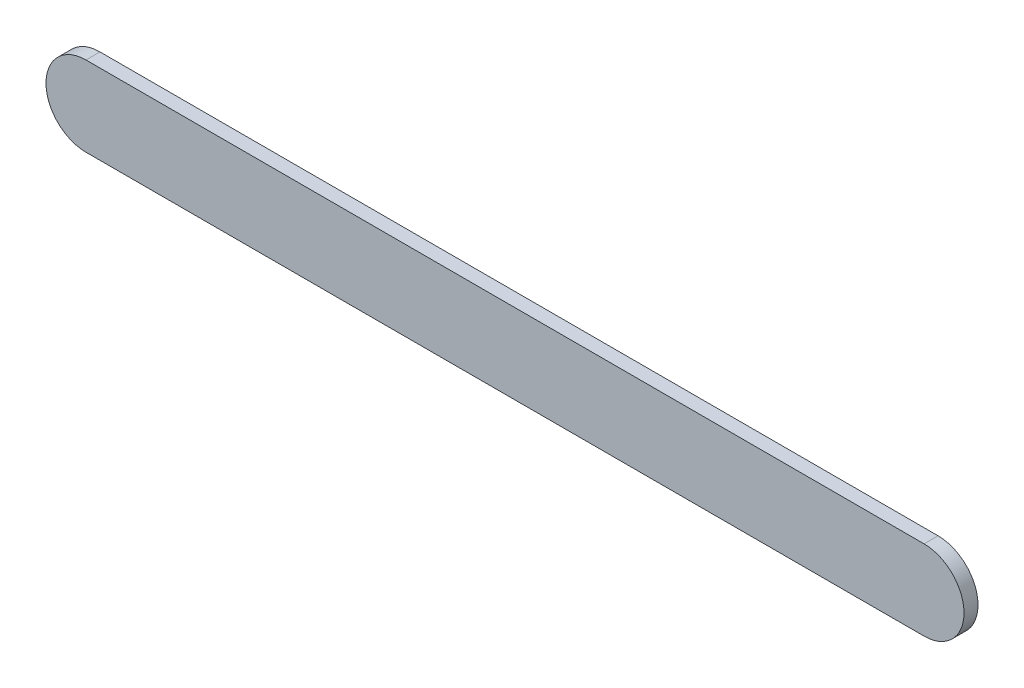
ISO-10303-21;
HEADER;
FILE_DESCRIPTION(('STEP AP214'),'2;1');
FILE_NAME('part.step','',(''),(''),'','','');
FILE_SCHEMA(('AUTOMOTIVE_DESIGN { 1 0 10303 214 1 1 1 1 }'));
ENDSEC;
DATA;
#1=APPLICATION_CONTEXT('core data for automotive mechanical design processes');
#2=APPLICATION_PROTOCOL_DEFINITION('international standard','automotive_design',2000,#1);
#3=PRODUCT_CONTEXT('',#1,'mechanical');
#4=PRODUCT('Part','Part','',(#3));
#5=PRODUCT_RELATED_PRODUCT_CATEGORY('part','',(#4));
#6=PRODUCT_DEFINITION_FORMATION('','',#4);
#7=PRODUCT_DEFINITION_CONTEXT('part definition',#1,'design');
#8=PRODUCT_DEFINITION('design','',#6,#7);
#9=PRODUCT_DEFINITION_SHAPE('','',#8);
#10=(LENGTH_UNIT() NAMED_UNIT(*) SI_UNIT(.MILLI.,.METRE.));
#11=(NAMED_UNIT(*) PLANE_ANGLE_UNIT() SI_UNIT($,.RADIAN.));
#12=(NAMED_UNIT(*) SI_UNIT($,.STERADIAN.) SOLID_ANGLE_UNIT());
#13=UNCERTAINTY_MEASURE_WITH_UNIT(LENGTH_MEASURE(1.E-05),#10,'distance_accuracy_value','');
#14=(GEOMETRIC_REPRESENTATION_CONTEXT(3) GLOBAL_UNCERTAINTY_ASSIGNED_CONTEXT((#13)) GLOBAL_UNIT_ASSIGNED_CONTEXT((#10,
#11,#12)) REPRESENTATION_CONTEXT('',''));
#15=CARTESIAN_POINT('',(0.,0.,0.));
#16=DIRECTION('',(0.,0.,1.));
#17=DIRECTION('',(1.,0.,0.));
#18=AXIS2_PLACEMENT_3D('',#15,#16,#17);
#19=CARTESIAN_POINT('',(83.627818,-121.45,1.635));
#20=DIRECTION('',(0.,0.,1.));
#21=DIRECTION('',(1.,0.,0.));
#22=AXIS2_PLACEMENT_3D('',#19,#20,#21);
#23=PLANE('',#22);
#24=DIRECTION('',(1.,0.,0.));
#25=VECTOR('',#24,1.);
#26=CARTESIAN_POINT('',(83.627818,-121.45,1.635));
#27=LINE('',#26,#25);
#28=CARTESIAN_POINT('',(83.627818,-121.45,1.635));
#29=VERTEX_POINT('',#28);
#30=CARTESIAN_POINT('',(85.725,-121.45,1.635));
#31=VERTEX_POINT('',#30);
#32=EDGE_CURVE('E81',#29,#31,#27,.T.);
#33=ORIENTED_EDGE('',*,*,#32,.T.);
#34=CARTESIAN_POINT('',(85.725,-121.35,1.635));
#35=DIRECTION('',(0.,0.,1.));
#36=DIRECTION('',(-1.42108547152E-13,-1.,0.));
#37=AXIS2_PLACEMENT_3D('',#34,#35,#36);
#38=CIRCLE('',#37,0.1);
#39=CARTESIAN_POINT('',(85.725,-121.25,1.635));
#40=VERTEX_POINT('',#39);
#41=EDGE_CURVE('E97',#31,#40,#38,.T.);
#42=ORIENTED_EDGE('',*,*,#41,.T.);
#43=DIRECTION('',(-1.,0.,0.));
#44=VECTOR('',#43,1.);
#45=CARTESIAN_POINT('',(85.725,-121.25,1.635));
#46=LINE('',#45,#44);
#47=CARTESIAN_POINT('',(83.627818,-121.25,1.635));
#48=VERTEX_POINT('',#47);
#49=EDGE_CURVE('E74',#40,#48,#46,.T.);
#50=ORIENTED_EDGE('',*,*,#49,.T.);
#51=CARTESIAN_POINT('',(83.627818,-121.35,1.635));
#52=DIRECTION('',(0.,0.,1.));
#53=DIRECTION('',(0.,1.,0.));
#54=AXIS2_PLACEMENT_3D('',#51,#52,#53);
#55=CIRCLE('',#54,0.1);
#56=EDGE_CURVE('E11',#48,#29,#55,.T.);
#57=ORIENTED_EDGE('',*,*,#56,.T.);
#58=EDGE_LOOP('',(#33,#42,#50,#57));
#59=FACE_BOUND('',#58,.T.);
#60=ADVANCED_FACE('F17',(#59),#23,.T.);
#61=CARTESIAN_POINT('',(83.627818,-121.45,1.6));
#62=DIRECTION('',(0.,0.,1.));
#63=DIRECTION('',(1.,0.,0.));
#64=AXIS2_PLACEMENT_3D('',#61,#62,#63);
#65=PLANE('',#64);
#66=CARTESIAN_POINT('',(83.627818,-121.35,1.6));
#67=DIRECTION('',(0.,0.,1.));
#68=DIRECTION('',(0.,1.,0.));
#69=AXIS2_PLACEMENT_3D('',#66,#67,#68);
#70=CIRCLE('',#69,0.1);
#71=CARTESIAN_POINT('',(83.627818,-121.25,1.6));
#72=VERTEX_POINT('',#71);
#73=CARTESIAN_POINT('',(83.627818,-121.45,1.6));
#74=VERTEX_POINT('',#73);
#75=EDGE_CURVE('E25',#72,#74,#70,.T.);
#76=ORIENTED_EDGE('',*,*,#75,.F.);
#77=DIRECTION('',(-1.,0.,0.));
#78=VECTOR('',#77,1.);
#79=CARTESIAN_POINT('',(85.725,-121.25,1.6));
#80=LINE('',#79,#78);
#81=CARTESIAN_POINT('',(85.725,-121.25,1.6));
#82=VERTEX_POINT('',#81);
#83=EDGE_CURVE('E101',#82,#72,#80,.T.);
#84=ORIENTED_EDGE('',*,*,#83,.F.);
#85=CARTESIAN_POINT('',(85.725,-121.35,1.6));
#86=DIRECTION('',(0.,0.,1.));
#87=DIRECTION('',(-1.42108547152E-13,-1.,0.));
#88=AXIS2_PLACEMENT_3D('',#85,#86,#87);
#89=CIRCLE('',#88,0.1);
#90=CARTESIAN_POINT('',(85.725,-121.45,1.6));
#91=VERTEX_POINT('',#90);
#92=EDGE_CURVE('E83',#91,#82,#89,.T.);
#93=ORIENTED_EDGE('',*,*,#92,.F.);
#94=DIRECTION('',(1.,0.,0.));
#95=VECTOR('',#94,1.);
#96=CARTESIAN_POINT('',(83.627818,-121.45,1.6));
#97=LINE('',#96,#95);
#98=EDGE_CURVE('E79',#74,#91,#97,.T.);
#99=ORIENTED_EDGE('',*,*,#98,.F.);
#100=EDGE_LOOP('',(#76,#84,#93,#99));
#101=FACE_BOUND('',#100,.T.);
#102=ADVANCED_FACE('F85',(#101),#65,.F.);
#103=CARTESIAN_POINT('',(83.627818,-121.35,1.6));
#104=DIRECTION('',(0.,0.,-1.));
#105=DIRECTION('',(0.,1.,0.));
#106=AXIS2_PLACEMENT_3D('',#103,#104,#105);
#107=CYLINDRICAL_SURFACE('',#106,0.1);
#108=ORIENTED_EDGE('',*,*,#75,.T.);
#109=DIRECTION('',(0.,0.,1.));
#110=VECTOR('',#109,1.);
#111=CARTESIAN_POINT('',(83.627818,-121.45,1.6));
#112=LINE('',#111,#110);
#113=EDGE_CURVE('E68',#74,#29,#112,.T.);
#114=ORIENTED_EDGE('',*,*,#113,.T.);
#115=ORIENTED_EDGE('',*,*,#56,.F.);
#116=DIRECTION('',(0.,0.,1.));
#117=VECTOR('',#116,1.);
#118=CARTESIAN_POINT('',(83.627818,-121.25,1.6));
#119=LINE('',#118,#117);
#120=EDGE_CURVE('E71',#72,#48,#119,.T.);
#121=ORIENTED_EDGE('',*,*,#120,.F.);
#122=EDGE_LOOP('',(#108,#114,#115,#121));
#123=FACE_BOUND('',#122,.T.);
#124=ADVANCED_FACE('F67',(#123),#107,.T.);
#125=CARTESIAN_POINT('',(85.725,-121.25,1.6));
#126=DIRECTION('',(0.,-1.,0.));
#127=DIRECTION('',(0.,0.,-1.));
#128=AXIS2_PLACEMENT_3D('',#125,#126,#127);
#129=PLANE('',#128);
#130=ORIENTED_EDGE('',*,*,#83,.T.);
#131=ORIENTED_EDGE('',*,*,#120,.T.);
#132=ORIENTED_EDGE('',*,*,#49,.F.);
#133=DIRECTION('',(0.,0.,1.));
#134=VECTOR('',#133,1.);
#135=CARTESIAN_POINT('',(85.725,-121.25,1.6));
#136=LINE('',#135,#134);
#137=EDGE_CURVE('E102',#82,#40,#136,.T.);
#138=ORIENTED_EDGE('',*,*,#137,.F.);
#139=EDGE_LOOP('',(#130,#131,#132,#138));
#140=FACE_BOUND('',#139,.T.);
#141=ADVANCED_FACE('F120',(#140),#129,.F.);
#142=CARTESIAN_POINT('',(85.725,-121.35,1.6));
#143=DIRECTION('',(0.,0.,-1.));
#144=DIRECTION('',(-1.42108547152E-13,-1.,0.));
#145=AXIS2_PLACEMENT_3D('',#142,#143,#144);
#146=CYLINDRICAL_SURFACE('',#145,0.1);
#147=ORIENTED_EDGE('',*,*,#92,.T.);
#148=ORIENTED_EDGE('',*,*,#137,.T.);
#149=ORIENTED_EDGE('',*,*,#41,.F.);
#150=DIRECTION('',(0.,0.,1.));
#151=VECTOR('',#150,1.);
#152=CARTESIAN_POINT('',(85.725,-121.45,1.6));
#153=LINE('',#152,#151);
#154=EDGE_CURVE('E89',#91,#31,#153,.T.);
#155=ORIENTED_EDGE('',*,*,#154,.F.);
#156=EDGE_LOOP('',(#147,#148,#149,#155));
#157=FACE_BOUND('',#156,.T.);
#158=ADVANCED_FACE('F122',(#157),#146,.T.);
#159=CARTESIAN_POINT('',(83.627818,-121.45,1.6));
#160=DIRECTION('',(0.,1.,0.));
#161=DIRECTION('',(1.,0.,0.));
#162=AXIS2_PLACEMENT_3D('',#159,#160,#161);
#163=PLANE('',#162);
#164=ORIENTED_EDGE('',*,*,#98,.T.);
#165=ORIENTED_EDGE('',*,*,#154,.T.);
#166=ORIENTED_EDGE('',*,*,#32,.F.);
#167=ORIENTED_EDGE('',*,*,#113,.F.);
#168=EDGE_LOOP('',(#164,#165,#166,#167));
#169=FACE_BOUND('',#168,.T.);
#170=ADVANCED_FACE('F77',(#169),#163,.F.);
#171=CLOSED_SHELL('',(#60,#102,#124,#141,#158,#170));
#172=MANIFOLD_SOLID_BREP('B1',#171);
#173=ADVANCED_BREP_SHAPE_REPRESENTATION('',(#18,#172),#14);
#174=SHAPE_DEFINITION_REPRESENTATION(#9,#173);
ENDSEC;
END-ISO-10303-21;
